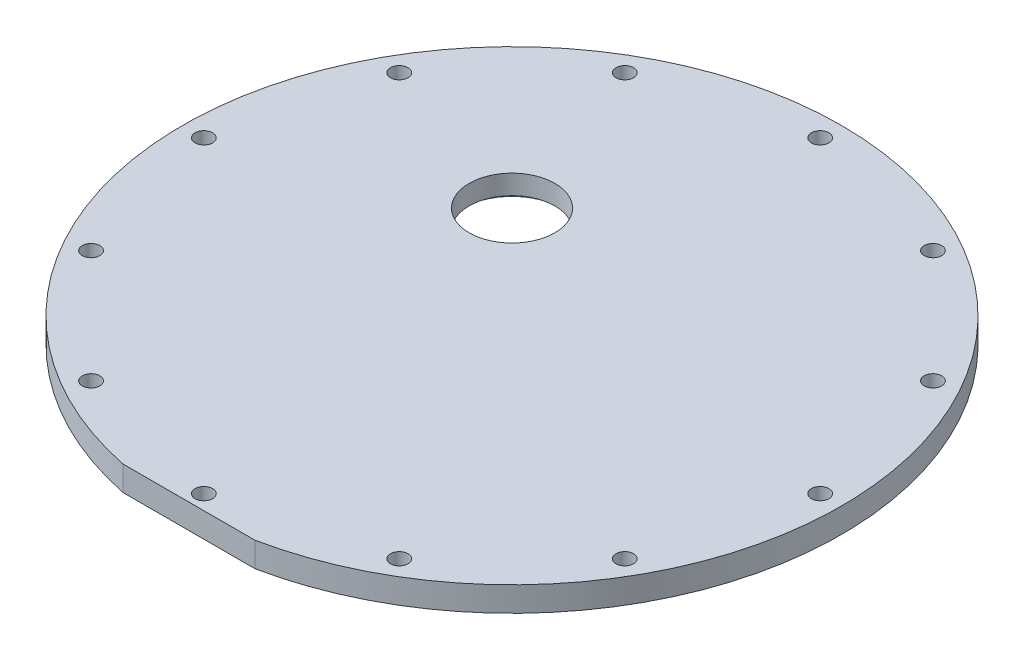
ISO-10303-21;
HEADER;
FILE_DESCRIPTION(('STEP AP214'),'2;1');
FILE_NAME('part.step','',(''),(''),'','','');
FILE_SCHEMA(('AUTOMOTIVE_DESIGN { 1 0 10303 214 1 1 1 1 }'));
ENDSEC;
DATA;
#1=APPLICATION_CONTEXT('core data for automotive mechanical design processes');
#2=APPLICATION_PROTOCOL_DEFINITION('international standard','automotive_design',2000,#1);
#3=PRODUCT_CONTEXT('',#1,'mechanical');
#4=PRODUCT('Part','Part','',(#3));
#5=PRODUCT_RELATED_PRODUCT_CATEGORY('part','',(#4));
#6=PRODUCT_DEFINITION_FORMATION('','',#4);
#7=PRODUCT_DEFINITION_CONTEXT('part definition',#1,'design');
#8=PRODUCT_DEFINITION('design','',#6,#7);
#9=PRODUCT_DEFINITION_SHAPE('','',#8);
#10=(LENGTH_UNIT() NAMED_UNIT(*) SI_UNIT(.MILLI.,.METRE.));
#11=(NAMED_UNIT(*) PLANE_ANGLE_UNIT() SI_UNIT($,.RADIAN.));
#12=(NAMED_UNIT(*) SI_UNIT($,.STERADIAN.) SOLID_ANGLE_UNIT());
#13=UNCERTAINTY_MEASURE_WITH_UNIT(LENGTH_MEASURE(1.E-05),#10,'distance_accuracy_value','');
#14=(GEOMETRIC_REPRESENTATION_CONTEXT(3) GLOBAL_UNCERTAINTY_ASSIGNED_CONTEXT((#13)) GLOBAL_UNIT_ASSIGNED_CONTEXT((#10,
#11,#12)) REPRESENTATION_CONTEXT('',''));
#15=CARTESIAN_POINT('',(0.,0.,0.));
#16=DIRECTION('',(0.,0.,1.));
#17=DIRECTION('',(1.,0.,0.));
#18=AXIS2_PLACEMENT_3D('',#15,#16,#17);
#19=CARTESIAN_POINT('',(-35.9210244842765,9.526,-35.9210244842767));
#20=DIRECTION('',(0.,-1.,0.));
#21=DIRECTION('',(0.,0.,-1.));
#22=AXIS2_PLACEMENT_3D('',#19,#20,#21);
#23=CYLINDRICAL_SURFACE('',#22,16.51);
#24=CARTESIAN_POINT('',(-35.9210244842765,9.52499999999999,-35.9210244842767));
#25=DIRECTION('',(0.,1.,0.));
#26=DIRECTION('',(0.,0.,1.));
#27=AXIS2_PLACEMENT_3D('',#24,#25,#26);
#28=CIRCLE('',#27,16.51);
#29=CARTESIAN_POINT('',(-35.9210244842765,9.52499999999999,-19.4110244842767));
#30=VERTEX_POINT('',#29);
#31=EDGE_CURVE('E188',#30,#30,#28,.F.);
#32=ORIENTED_EDGE('',*,*,#31,.F.);
#33=EDGE_LOOP('',(#32));
#34=FACE_BOUND('',#33,.T.);
#35=CARTESIAN_POINT('',(-35.9210244842765,2.,-35.9210244842767));
#36=DIRECTION('',(0.,-1.,0.));
#37=DIRECTION('',(0.,0.,-1.));
#38=AXIS2_PLACEMENT_3D('',#35,#36,#37);
#39=CIRCLE('',#38,16.51);
#40=CARTESIAN_POINT('',(-35.9210244842765,2.,-52.4310244842767));
#41=VERTEX_POINT('',#40);
#42=EDGE_CURVE('E47',#41,#41,#39,.F.);
#43=ORIENTED_EDGE('',*,*,#42,.F.);
#44=EDGE_LOOP('',(#43));
#45=FACE_BOUND('',#44,.T.);
#46=ADVANCED_FACE('F43',(#34,#45),#23,.F.);
#47=CARTESIAN_POINT('',(0.,0.,0.));
#48=DIRECTION('',(0.,-1.,0.));
#49=DIRECTION('',(0.,0.,-1.));
#50=AXIS2_PLACEMENT_3D('',#47,#48,#49);
#51=PLANE('',#50);
#52=CARTESIAN_POINT('',(-35.9210244842765,0.,-35.9210244842767));
#53=DIRECTION('',(0.,-1.,0.));
#54=DIRECTION('',(0.,0.,-1.));
#55=AXIS2_PLACEMENT_3D('',#52,#53,#54);
#56=CIRCLE('',#55,19.);
#57=CARTESIAN_POINT('',(-35.9210244842765,0.,-54.9210244842767));
#58=VERTEX_POINT('',#57);
#59=EDGE_CURVE('E192',#58,#58,#56,.T.);
#60=ORIENTED_EDGE('',*,*,#59,.F.);
#61=EDGE_LOOP('',(#60));
#62=FACE_BOUND('',#61,.T.);
#63=DIRECTION('',(-1.,0.,0.));
#64=VECTOR('',#63,1.);
#65=CARTESIAN_POINT('',(-25.4,0.,124.434078933385));
#66=LINE('',#65,#64);
#67=CARTESIAN_POINT('',(25.4,0.,124.434078933385));
#68=VERTEX_POINT('',#67);
#69=CARTESIAN_POINT('',(-25.4,0.,124.434078933385));
#70=VERTEX_POINT('',#69);
#71=EDGE_CURVE('E77',#68,#70,#66,.T.);
#72=ORIENTED_EDGE('',*,*,#71,.T.);
#73=CARTESIAN_POINT('',(0.,0.,0.));
#74=DIRECTION('',(0.,-1.,0.));
#75=DIRECTION('',(0.,0.,-1.));
#76=AXIS2_PLACEMENT_3D('',#73,#74,#75);
#77=CIRCLE('',#76,127.);
#78=EDGE_CURVE('E11',#70,#68,#77,.T.);
#79=ORIENTED_EDGE('',*,*,#78,.T.);
#80=EDGE_LOOP('',(#72,#79));
#81=FACE_BOUND('',#80,.T.);
#82=CARTESIAN_POINT('',(0.,0.,-118.745));
#83=DIRECTION('',(0.,-1.,0.));
#84=DIRECTION('',(0.,0.,-1.));
#85=AXIS2_PLACEMENT_3D('',#82,#83,#84);
#86=CIRCLE('',#85,3.3782);
#87=CARTESIAN_POINT('',(0.,0.,-122.1232));
#88=VERTEX_POINT('',#87);
#89=EDGE_CURVE('E177',#88,#88,#86,.T.);
#90=ORIENTED_EDGE('',*,*,#89,.F.);
#91=EDGE_LOOP('',(#90));
#92=FACE_BOUND('',#91,.T.);
#93=CARTESIAN_POINT('',(59.3725,0.,-102.836186572383));
#94=DIRECTION('',(0.,-1.,0.));
#95=DIRECTION('',(0.,0.,-1.));
#96=AXIS2_PLACEMENT_3D('',#93,#94,#95);
#97=CIRCLE('',#96,3.3782);
#98=CARTESIAN_POINT('',(59.3725,0.,-106.214386572383));
#99=VERTEX_POINT('',#98);
#100=EDGE_CURVE('E169',#99,#99,#97,.T.);
#101=ORIENTED_EDGE('',*,*,#100,.F.);
#102=EDGE_LOOP('',(#101));
#103=FACE_BOUND('',#102,.T.);
#104=CARTESIAN_POINT('',(102.836186572383,0.,-59.3725));
#105=DIRECTION('',(0.,-1.,0.));
#106=DIRECTION('',(0.,0.,-1.));
#107=AXIS2_PLACEMENT_3D('',#104,#105,#106);
#108=CIRCLE('',#107,3.3782);
#109=CARTESIAN_POINT('',(102.836186572383,0.,-62.7507));
#110=VERTEX_POINT('',#109);
#111=EDGE_CURVE('E161',#110,#110,#108,.T.);
#112=ORIENTED_EDGE('',*,*,#111,.F.);
#113=EDGE_LOOP('',(#112));
#114=FACE_BOUND('',#113,.T.);
#115=CARTESIAN_POINT('',(118.745,0.,0.));
#116=DIRECTION('',(0.,-1.,0.));
#117=DIRECTION('',(0.,0.,-1.));
#118=AXIS2_PLACEMENT_3D('',#115,#116,#117);
#119=CIRCLE('',#118,3.3782);
#120=CARTESIAN_POINT('',(118.745,0.,-3.37820000000001));
#121=VERTEX_POINT('',#120);
#122=EDGE_CURVE('E153',#121,#121,#119,.T.);
#123=ORIENTED_EDGE('',*,*,#122,.F.);
#124=EDGE_LOOP('',(#123));
#125=FACE_BOUND('',#124,.T.);
#126=CARTESIAN_POINT('',(102.836186572383,0.,59.3725));
#127=DIRECTION('',(0.,-1.,0.));
#128=DIRECTION('',(0.,0.,-1.));
#129=AXIS2_PLACEMENT_3D('',#126,#127,#128);
#130=CIRCLE('',#129,3.3782);
#131=CARTESIAN_POINT('',(102.836186572383,0.,55.9943));
#132=VERTEX_POINT('',#131);
#133=EDGE_CURVE('E145',#132,#132,#130,.T.);
#134=ORIENTED_EDGE('',*,*,#133,.F.);
#135=EDGE_LOOP('',(#134));
#136=FACE_BOUND('',#135,.T.);
#137=CARTESIAN_POINT('',(59.3725,0.,102.836186572383));
#138=DIRECTION('',(0.,-1.,0.));
#139=DIRECTION('',(0.,0.,-1.));
#140=AXIS2_PLACEMENT_3D('',#137,#138,#139);
#141=CIRCLE('',#140,3.3782);
#142=CARTESIAN_POINT('',(59.3725,0.,99.4579865723831));
#143=VERTEX_POINT('',#142);
#144=EDGE_CURVE('E137',#143,#143,#141,.T.);
#145=ORIENTED_EDGE('',*,*,#144,.F.);
#146=EDGE_LOOP('',(#145));
#147=FACE_BOUND('',#146,.T.);
#148=CARTESIAN_POINT('',(0.,0.,118.745));
#149=DIRECTION('',(0.,-1.,0.));
#150=DIRECTION('',(0.,0.,-1.));
#151=AXIS2_PLACEMENT_3D('',#148,#149,#150);
#152=CIRCLE('',#151,3.3782);
#153=CARTESIAN_POINT('',(0.,0.,115.3668));
#154=VERTEX_POINT('',#153);
#155=EDGE_CURVE('E129',#154,#154,#152,.T.);
#156=ORIENTED_EDGE('',*,*,#155,.F.);
#157=EDGE_LOOP('',(#156));
#158=FACE_BOUND('',#157,.T.);
#159=CARTESIAN_POINT('',(-59.3725,0.,102.836186572383));
#160=DIRECTION('',(0.,-1.,0.));
#161=DIRECTION('',(0.,0.,-1.));
#162=AXIS2_PLACEMENT_3D('',#159,#160,#161);
#163=CIRCLE('',#162,3.3782);
#164=CARTESIAN_POINT('',(-59.3725,0.,99.4579865723832));
#165=VERTEX_POINT('',#164);
#166=EDGE_CURVE('E121',#165,#165,#163,.T.);
#167=ORIENTED_EDGE('',*,*,#166,.F.);
#168=EDGE_LOOP('',(#167));
#169=FACE_BOUND('',#168,.T.);
#170=CARTESIAN_POINT('',(-102.836186572383,0.,59.3725000000001));
#171=DIRECTION('',(0.,-1.,0.));
#172=DIRECTION('',(0.,0.,-1.));
#173=AXIS2_PLACEMENT_3D('',#170,#171,#172);
#174=CIRCLE('',#173,3.3782);
#175=CARTESIAN_POINT('',(-102.836186572383,0.,55.9943000000001));
#176=VERTEX_POINT('',#175);
#177=EDGE_CURVE('E113',#176,#176,#174,.T.);
#178=ORIENTED_EDGE('',*,*,#177,.F.);
#179=EDGE_LOOP('',(#178));
#180=FACE_BOUND('',#179,.T.);
#181=CARTESIAN_POINT('',(-118.745,0.,0.));
#182=DIRECTION('',(0.,-1.,0.));
#183=DIRECTION('',(0.,0.,-1.));
#184=AXIS2_PLACEMENT_3D('',#181,#182,#183);
#185=CIRCLE('',#184,3.3782);
#186=CARTESIAN_POINT('',(-118.745,0.,-3.37819999999998));
#187=VERTEX_POINT('',#186);
#188=EDGE_CURVE('E105',#187,#187,#185,.T.);
#189=ORIENTED_EDGE('',*,*,#188,.F.);
#190=EDGE_LOOP('',(#189));
#191=FACE_BOUND('',#190,.T.);
#192=CARTESIAN_POINT('',(-102.836186572383,0.,-59.3724999999999));
#193=DIRECTION('',(0.,-1.,0.));
#194=DIRECTION('',(0.,0.,-1.));
#195=AXIS2_PLACEMENT_3D('',#192,#193,#194);
#196=CIRCLE('',#195,3.3782);
#197=CARTESIAN_POINT('',(-102.836186572383,0.,-62.7506999999999));
#198=VERTEX_POINT('',#197);
#199=EDGE_CURVE('E97',#198,#198,#196,.T.);
#200=ORIENTED_EDGE('',*,*,#199,.F.);
#201=EDGE_LOOP('',(#200));
#202=FACE_BOUND('',#201,.T.);
#203=CARTESIAN_POINT('',(-59.3725,0.,-102.836186572383));
#204=DIRECTION('',(0.,-1.,0.));
#205=DIRECTION('',(0.,0.,-1.));
#206=AXIS2_PLACEMENT_3D('',#203,#204,#205);
#207=CIRCLE('',#206,3.3782);
#208=CARTESIAN_POINT('',(-59.3725,0.,-106.214386572383));
#209=VERTEX_POINT('',#208);
#210=EDGE_CURVE('E87',#209,#209,#207,.T.);
#211=ORIENTED_EDGE('',*,*,#210,.F.);
#212=EDGE_LOOP('',(#211));
#213=FACE_BOUND('',#212,.T.);
#214=ADVANCED_FACE('F45',(#62,#81,#92,#103,#114,#125,#136,#147,#158,#169,#180,#191,#202,#213),
#51,.T.);
#215=CARTESIAN_POINT('',(0.,0.,0.));
#216=DIRECTION('',(0.,-1.,0.));
#217=DIRECTION('',(0.,0.,-1.));
#218=AXIS2_PLACEMENT_3D('',#215,#216,#217);
#219=CYLINDRICAL_SURFACE('',#218,127.);
#220=DIRECTION('',(0.,-1.,0.));
#221=VECTOR('',#220,1.);
#222=CARTESIAN_POINT('',(25.4,0.,124.434078933385));
#223=LINE('',#222,#221);
#224=CARTESIAN_POINT('',(25.4,9.525,124.434078933385));
#225=VERTEX_POINT('',#224);
#226=EDGE_CURVE('E60',#225,#68,#223,.T.);
#227=ORIENTED_EDGE('',*,*,#226,.T.);
#228=ORIENTED_EDGE('',*,*,#78,.F.);
#229=DIRECTION('',(0.,-1.,0.));
#230=VECTOR('',#229,1.);
#231=CARTESIAN_POINT('',(-25.4,0.,124.434078933385));
#232=LINE('',#231,#230);
#233=CARTESIAN_POINT('',(-25.4,9.525,124.434078933385));
#234=VERTEX_POINT('',#233);
#235=EDGE_CURVE('E65',#70,#234,#232,.F.);
#236=ORIENTED_EDGE('',*,*,#235,.T.);
#237=CARTESIAN_POINT('',(0.,9.525,0.));
#238=DIRECTION('',(0.,-1.,0.));
#239=DIRECTION('',(0.,0.,-1.));
#240=AXIS2_PLACEMENT_3D('',#237,#238,#239);
#241=CIRCLE('',#240,127.);
#242=EDGE_CURVE('E53',#234,#225,#241,.T.);
#243=ORIENTED_EDGE('',*,*,#242,.T.);
#244=EDGE_LOOP('',(#227,#228,#236,#243));
#245=FACE_BOUND('',#244,.T.);
#246=ADVANCED_FACE('F81',(#245),#219,.T.);
#247=CARTESIAN_POINT('',(127.,9.52499999999999,0.));
#248=DIRECTION('',(0.,1.,0.));
#249=DIRECTION('',(0.,0.,1.));
#250=AXIS2_PLACEMENT_3D('',#247,#248,#249);
#251=PLANE('',#250);
#252=ORIENTED_EDGE('',*,*,#31,.T.);
#253=EDGE_LOOP('',(#252));
#254=FACE_BOUND('',#253,.T.);
#255=DIRECTION('',(-1.,0.,0.));
#256=VECTOR('',#255,1.);
#257=CARTESIAN_POINT('',(-25.4,9.52499999999999,124.434078933385));
#258=LINE('',#257,#256);
#259=EDGE_CURVE('E70',#225,#234,#258,.T.);
#260=ORIENTED_EDGE('',*,*,#259,.F.);
#261=ORIENTED_EDGE('',*,*,#242,.F.);
#262=EDGE_LOOP('',(#260,#261));
#263=FACE_BOUND('',#262,.T.);
#264=CARTESIAN_POINT('',(0.,9.52499999999999,-118.745));
#265=DIRECTION('',(0.,1.,0.));
#266=DIRECTION('',(0.,0.,1.));
#267=AXIS2_PLACEMENT_3D('',#264,#265,#266);
#268=CIRCLE('',#267,3.3782);
#269=CARTESIAN_POINT('',(0.,9.52499999999999,-115.3668));
#270=VERTEX_POINT('',#269);
#271=EDGE_CURVE('E76',#270,#270,#268,.T.);
#272=ORIENTED_EDGE('',*,*,#271,.F.);
#273=EDGE_LOOP('',(#272));
#274=FACE_BOUND('',#273,.T.);
#275=CARTESIAN_POINT('',(59.3725,9.52499999999999,-102.836186572383));
#276=DIRECTION('',(0.,1.,0.));
#277=DIRECTION('',(0.,0.,1.));
#278=AXIS2_PLACEMENT_3D('',#275,#276,#277);
#279=CIRCLE('',#278,3.3782);
#280=CARTESIAN_POINT('',(59.3725,9.52499999999999,-99.4579865723832));
#281=VERTEX_POINT('',#280);
#282=EDGE_CURVE('E173',#281,#281,#279,.T.);
#283=ORIENTED_EDGE('',*,*,#282,.F.);
#284=EDGE_LOOP('',(#283));
#285=FACE_BOUND('',#284,.T.);
#286=CARTESIAN_POINT('',(102.836186572383,9.52499999999999,-59.3725));
#287=DIRECTION('',(0.,1.,0.));
#288=DIRECTION('',(0.,0.,1.));
#289=AXIS2_PLACEMENT_3D('',#286,#287,#288);
#290=CIRCLE('',#289,3.3782);
#291=CARTESIAN_POINT('',(102.836186572383,9.52499999999999,-55.9943));
#292=VERTEX_POINT('',#291);
#293=EDGE_CURVE('E165',#292,#292,#290,.T.);
#294=ORIENTED_EDGE('',*,*,#293,.F.);
#295=EDGE_LOOP('',(#294));
#296=FACE_BOUND('',#295,.T.);
#297=CARTESIAN_POINT('',(118.745,9.52499999999999,0.));
#298=DIRECTION('',(0.,1.,0.));
#299=DIRECTION('',(0.,0.,1.));
#300=AXIS2_PLACEMENT_3D('',#297,#298,#299);
#301=CIRCLE('',#300,3.3782);
#302=CARTESIAN_POINT('',(118.745,9.52499999999999,3.37819999999999));
#303=VERTEX_POINT('',#302);
#304=EDGE_CURVE('E157',#303,#303,#301,.T.);
#305=ORIENTED_EDGE('',*,*,#304,.F.);
#306=EDGE_LOOP('',(#305));
#307=FACE_BOUND('',#306,.T.);
#308=CARTESIAN_POINT('',(102.836186572383,9.52499999999999,59.3725));
#309=DIRECTION('',(0.,1.,0.));
#310=DIRECTION('',(0.,0.,1.));
#311=AXIS2_PLACEMENT_3D('',#308,#309,#310);
#312=CIRCLE('',#311,3.3782);
#313=CARTESIAN_POINT('',(102.836186572383,9.52499999999999,62.7507));
#314=VERTEX_POINT('',#313);
#315=EDGE_CURVE('E149',#314,#314,#312,.T.);
#316=ORIENTED_EDGE('',*,*,#315,.F.);
#317=EDGE_LOOP('',(#316));
#318=FACE_BOUND('',#317,.T.);
#319=CARTESIAN_POINT('',(59.3725,9.52499999999999,102.836186572383));
#320=DIRECTION('',(0.,1.,0.));
#321=DIRECTION('',(0.,0.,1.));
#322=AXIS2_PLACEMENT_3D('',#319,#320,#321);
#323=CIRCLE('',#322,3.3782);
#324=CARTESIAN_POINT('',(59.3725,9.52499999999999,106.214386572383));
#325=VERTEX_POINT('',#324);
#326=EDGE_CURVE('E141',#325,#325,#323,.T.);
#327=ORIENTED_EDGE('',*,*,#326,.F.);
#328=EDGE_LOOP('',(#327));
#329=FACE_BOUND('',#328,.T.);
#330=CARTESIAN_POINT('',(0.,9.52499999999999,118.745));
#331=DIRECTION('',(0.,1.,0.));
#332=DIRECTION('',(0.,0.,1.));
#333=AXIS2_PLACEMENT_3D('',#330,#331,#332);
#334=CIRCLE('',#333,3.3782);
#335=CARTESIAN_POINT('',(0.,9.52499999999999,122.1232));
#336=VERTEX_POINT('',#335);
#337=EDGE_CURVE('E133',#336,#336,#334,.T.);
#338=ORIENTED_EDGE('',*,*,#337,.F.);
#339=EDGE_LOOP('',(#338));
#340=FACE_BOUND('',#339,.T.);
#341=CARTESIAN_POINT('',(-59.3725,9.52499999999999,102.836186572383));
#342=DIRECTION('',(0.,1.,0.));
#343=DIRECTION('',(0.,0.,1.));
#344=AXIS2_PLACEMENT_3D('',#341,#342,#343);
#345=CIRCLE('',#344,3.3782);
#346=CARTESIAN_POINT('',(-59.3725,9.52499999999999,106.214386572383));
#347=VERTEX_POINT('',#346);
#348=EDGE_CURVE('E125',#347,#347,#345,.T.);
#349=ORIENTED_EDGE('',*,*,#348,.F.);
#350=EDGE_LOOP('',(#349));
#351=FACE_BOUND('',#350,.T.);
#352=CARTESIAN_POINT('',(-102.836186572383,9.52499999999999,59.3725000000001));
#353=DIRECTION('',(0.,1.,0.));
#354=DIRECTION('',(0.,0.,1.));
#355=AXIS2_PLACEMENT_3D('',#352,#353,#354);
#356=CIRCLE('',#355,3.3782);
#357=CARTESIAN_POINT('',(-102.836186572383,9.52499999999999,62.7507000000001));
#358=VERTEX_POINT('',#357);
#359=EDGE_CURVE('E117',#358,#358,#356,.T.);
#360=ORIENTED_EDGE('',*,*,#359,.F.);
#361=EDGE_LOOP('',(#360));
#362=FACE_BOUND('',#361,.T.);
#363=CARTESIAN_POINT('',(-118.745,9.52499999999999,0.));
#364=DIRECTION('',(0.,1.,0.));
#365=DIRECTION('',(0.,0.,1.));
#366=AXIS2_PLACEMENT_3D('',#363,#364,#365);
#367=CIRCLE('',#366,3.3782);
#368=CARTESIAN_POINT('',(-118.745,9.52499999999999,3.37820000000002));
#369=VERTEX_POINT('',#368);
#370=EDGE_CURVE('E109',#369,#369,#367,.T.);
#371=ORIENTED_EDGE('',*,*,#370,.F.);
#372=EDGE_LOOP('',(#371));
#373=FACE_BOUND('',#372,.T.);
#374=CARTESIAN_POINT('',(-102.836186572383,9.52499999999999,-59.3724999999999));
#375=DIRECTION('',(0.,1.,0.));
#376=DIRECTION('',(0.,0.,1.));
#377=AXIS2_PLACEMENT_3D('',#374,#375,#376);
#378=CIRCLE('',#377,3.3782);
#379=CARTESIAN_POINT('',(-102.836186572383,9.52499999999999,-55.9942999999999));
#380=VERTEX_POINT('',#379);
#381=EDGE_CURVE('E101',#380,#380,#378,.T.);
#382=ORIENTED_EDGE('',*,*,#381,.F.);
#383=EDGE_LOOP('',(#382));
#384=FACE_BOUND('',#383,.T.);
#385=CARTESIAN_POINT('',(-59.3725,9.52499999999999,-102.836186572383));
#386=DIRECTION('',(0.,1.,0.));
#387=DIRECTION('',(0.,0.,1.));
#388=AXIS2_PLACEMENT_3D('',#385,#386,#387);
#389=CIRCLE('',#388,3.3782);
#390=CARTESIAN_POINT('',(-59.3725,9.52499999999999,-99.4579865723831));
#391=VERTEX_POINT('',#390);
#392=EDGE_CURVE('E91',#391,#391,#389,.T.);
#393=ORIENTED_EDGE('',*,*,#392,.F.);
#394=EDGE_LOOP('',(#393));
#395=FACE_BOUND('',#394,.T.);
#396=ADVANCED_FACE('F84',(#254,#263,#274,#285,#296,#307,#318,#329,#340,#351,#362,#373,#384,
#395),#251,.T.);
#397=CARTESIAN_POINT('',(-59.3725,9.52499999999999,-102.836186572383));
#398=DIRECTION('',(0.,1.,0.));
#399=DIRECTION('',(0.,0.,1.));
#400=AXIS2_PLACEMENT_3D('',#397,#398,#399);
#401=CYLINDRICAL_SURFACE('',#400,3.3782);
#402=ORIENTED_EDGE('',*,*,#392,.T.);
#403=EDGE_LOOP('',(#402));
#404=FACE_BOUND('',#403,.T.);
#405=ORIENTED_EDGE('',*,*,#210,.T.);
#406=EDGE_LOOP('',(#405));
#407=FACE_BOUND('',#406,.T.);
#408=ADVANCED_FACE('F264',(#404,#407),#401,.F.);
#409=CARTESIAN_POINT('',(-102.836186572383,9.52499999999999,-59.3724999999999));
#410=DIRECTION('',(0.,1.,0.));
#411=DIRECTION('',(0.,0.,1.));
#412=AXIS2_PLACEMENT_3D('',#409,#410,#411);
#413=CYLINDRICAL_SURFACE('',#412,3.3782);
#414=ORIENTED_EDGE('',*,*,#381,.T.);
#415=EDGE_LOOP('',(#414));
#416=FACE_BOUND('',#415,.T.);
#417=ORIENTED_EDGE('',*,*,#199,.T.);
#418=EDGE_LOOP('',(#417));
#419=FACE_BOUND('',#418,.T.);
#420=ADVANCED_FACE('F260',(#416,#419),#413,.F.);
#421=CARTESIAN_POINT('',(-118.745,9.52499999999999,0.));
#422=DIRECTION('',(0.,1.,0.));
#423=DIRECTION('',(0.,0.,1.));
#424=AXIS2_PLACEMENT_3D('',#421,#422,#423);
#425=CYLINDRICAL_SURFACE('',#424,3.3782);
#426=ORIENTED_EDGE('',*,*,#370,.T.);
#427=EDGE_LOOP('',(#426));
#428=FACE_BOUND('',#427,.T.);
#429=ORIENTED_EDGE('',*,*,#188,.T.);
#430=EDGE_LOOP('',(#429));
#431=FACE_BOUND('',#430,.T.);
#432=ADVANCED_FACE('F256',(#428,#431),#425,.F.);
#433=CARTESIAN_POINT('',(-102.836186572383,9.52499999999999,59.3725000000001));
#434=DIRECTION('',(0.,1.,0.));
#435=DIRECTION('',(0.,0.,1.));
#436=AXIS2_PLACEMENT_3D('',#433,#434,#435);
#437=CYLINDRICAL_SURFACE('',#436,3.3782);
#438=ORIENTED_EDGE('',*,*,#359,.T.);
#439=EDGE_LOOP('',(#438));
#440=FACE_BOUND('',#439,.T.);
#441=ORIENTED_EDGE('',*,*,#177,.T.);
#442=EDGE_LOOP('',(#441));
#443=FACE_BOUND('',#442,.T.);
#444=ADVANCED_FACE('F252',(#440,#443),#437,.F.);
#445=CARTESIAN_POINT('',(-59.3725,9.52499999999999,102.836186572383));
#446=DIRECTION('',(0.,1.,0.));
#447=DIRECTION('',(0.,0.,1.));
#448=AXIS2_PLACEMENT_3D('',#445,#446,#447);
#449=CYLINDRICAL_SURFACE('',#448,3.3782);
#450=ORIENTED_EDGE('',*,*,#348,.T.);
#451=EDGE_LOOP('',(#450));
#452=FACE_BOUND('',#451,.T.);
#453=ORIENTED_EDGE('',*,*,#166,.T.);
#454=EDGE_LOOP('',(#453));
#455=FACE_BOUND('',#454,.T.);
#456=ADVANCED_FACE('F248',(#452,#455),#449,.F.);
#457=CARTESIAN_POINT('',(0.,9.52499999999999,118.745));
#458=DIRECTION('',(0.,1.,0.));
#459=DIRECTION('',(0.,0.,1.));
#460=AXIS2_PLACEMENT_3D('',#457,#458,#459);
#461=CYLINDRICAL_SURFACE('',#460,3.3782);
#462=ORIENTED_EDGE('',*,*,#337,.T.);
#463=EDGE_LOOP('',(#462));
#464=FACE_BOUND('',#463,.T.);
#465=ORIENTED_EDGE('',*,*,#155,.T.);
#466=EDGE_LOOP('',(#465));
#467=FACE_BOUND('',#466,.T.);
#468=ADVANCED_FACE('F244',(#464,#467),#461,.F.);
#469=CARTESIAN_POINT('',(59.3725,9.52499999999999,102.836186572383));
#470=DIRECTION('',(0.,1.,0.));
#471=DIRECTION('',(0.,0.,1.));
#472=AXIS2_PLACEMENT_3D('',#469,#470,#471);
#473=CYLINDRICAL_SURFACE('',#472,3.3782);
#474=ORIENTED_EDGE('',*,*,#326,.T.);
#475=EDGE_LOOP('',(#474));
#476=FACE_BOUND('',#475,.T.);
#477=ORIENTED_EDGE('',*,*,#144,.T.);
#478=EDGE_LOOP('',(#477));
#479=FACE_BOUND('',#478,.T.);
#480=ADVANCED_FACE('F240',(#476,#479),#473,.F.);
#481=CARTESIAN_POINT('',(102.836186572383,9.52499999999999,59.3725));
#482=DIRECTION('',(0.,1.,0.));
#483=DIRECTION('',(0.,0.,1.));
#484=AXIS2_PLACEMENT_3D('',#481,#482,#483);
#485=CYLINDRICAL_SURFACE('',#484,3.3782);
#486=ORIENTED_EDGE('',*,*,#315,.T.);
#487=EDGE_LOOP('',(#486));
#488=FACE_BOUND('',#487,.T.);
#489=ORIENTED_EDGE('',*,*,#133,.T.);
#490=EDGE_LOOP('',(#489));
#491=FACE_BOUND('',#490,.T.);
#492=ADVANCED_FACE('F236',(#488,#491),#485,.F.);
#493=CARTESIAN_POINT('',(118.745,9.52499999999999,0.));
#494=DIRECTION('',(0.,1.,0.));
#495=DIRECTION('',(0.,0.,1.));
#496=AXIS2_PLACEMENT_3D('',#493,#494,#495);
#497=CYLINDRICAL_SURFACE('',#496,3.3782);
#498=ORIENTED_EDGE('',*,*,#304,.T.);
#499=EDGE_LOOP('',(#498));
#500=FACE_BOUND('',#499,.T.);
#501=ORIENTED_EDGE('',*,*,#122,.T.);
#502=EDGE_LOOP('',(#501));
#503=FACE_BOUND('',#502,.T.);
#504=ADVANCED_FACE('F232',(#500,#503),#497,.F.);
#505=CARTESIAN_POINT('',(102.836186572383,9.52499999999999,-59.3725));
#506=DIRECTION('',(0.,1.,0.));
#507=DIRECTION('',(0.,0.,1.));
#508=AXIS2_PLACEMENT_3D('',#505,#506,#507);
#509=CYLINDRICAL_SURFACE('',#508,3.3782);
#510=ORIENTED_EDGE('',*,*,#293,.T.);
#511=EDGE_LOOP('',(#510));
#512=FACE_BOUND('',#511,.T.);
#513=ORIENTED_EDGE('',*,*,#111,.T.);
#514=EDGE_LOOP('',(#513));
#515=FACE_BOUND('',#514,.T.);
#516=ADVANCED_FACE('F228',(#512,#515),#509,.F.);
#517=CARTESIAN_POINT('',(59.3725,9.52499999999999,-102.836186572383));
#518=DIRECTION('',(0.,1.,0.));
#519=DIRECTION('',(0.,0.,1.));
#520=AXIS2_PLACEMENT_3D('',#517,#518,#519);
#521=CYLINDRICAL_SURFACE('',#520,3.3782);
#522=ORIENTED_EDGE('',*,*,#282,.T.);
#523=EDGE_LOOP('',(#522));
#524=FACE_BOUND('',#523,.T.);
#525=ORIENTED_EDGE('',*,*,#100,.T.);
#526=EDGE_LOOP('',(#525));
#527=FACE_BOUND('',#526,.T.);
#528=ADVANCED_FACE('F224',(#524,#527),#521,.F.);
#529=CARTESIAN_POINT('',(0.,9.52499999999999,-118.745));
#530=DIRECTION('',(0.,1.,0.));
#531=DIRECTION('',(0.,0.,1.));
#532=AXIS2_PLACEMENT_3D('',#529,#530,#531);
#533=CYLINDRICAL_SURFACE('',#532,3.3782);
#534=ORIENTED_EDGE('',*,*,#271,.T.);
#535=EDGE_LOOP('',(#534));
#536=FACE_BOUND('',#535,.T.);
#537=ORIENTED_EDGE('',*,*,#89,.T.);
#538=EDGE_LOOP('',(#537));
#539=FACE_BOUND('',#538,.T.);
#540=ADVANCED_FACE('F221',(#536,#539),#533,.F.);
#541=CARTESIAN_POINT('',(-25.4,-0.000999999999999265,124.434078933385));
#542=DIRECTION('',(0.,0.,-1.));
#543=DIRECTION('',(-1.,0.,0.));
#544=AXIS2_PLACEMENT_3D('',#541,#542,#543);
#545=PLANE('',#544);
#546=ORIENTED_EDGE('',*,*,#226,.F.);
#547=ORIENTED_EDGE('',*,*,#259,.T.);
#548=ORIENTED_EDGE('',*,*,#235,.F.);
#549=ORIENTED_EDGE('',*,*,#71,.F.);
#550=EDGE_LOOP('',(#546,#547,#548,#549));
#551=FACE_BOUND('',#550,.T.);
#552=ADVANCED_FACE('F71',(#551),#545,.F.);
#553=CARTESIAN_POINT('',(-35.9210244842765,2.,-35.9210244842767));
#554=DIRECTION('',(0.,-1.,0.));
#555=DIRECTION('',(0.,0.,-1.));
#556=AXIS2_PLACEMENT_3D('',#553,#554,#555);
#557=PLANE('',#556);
#558=CARTESIAN_POINT('',(-35.9210244842765,2.,-35.9210244842767));
#559=DIRECTION('',(0.,-1.,0.));
#560=DIRECTION('',(0.,0.,-1.));
#561=AXIS2_PLACEMENT_3D('',#558,#559,#560);
#562=CIRCLE('',#561,19.);
#563=CARTESIAN_POINT('',(-35.9210244842765,2.,-54.9210244842767));
#564=VERTEX_POINT('',#563);
#565=EDGE_CURVE('E196',#564,#564,#562,.T.);
#566=ORIENTED_EDGE('',*,*,#565,.T.);
#567=EDGE_LOOP('',(#566));
#568=FACE_BOUND('',#567,.T.);
#569=ORIENTED_EDGE('',*,*,#42,.T.);
#570=EDGE_LOOP('',(#569));
#571=FACE_BOUND('',#570,.T.);
#572=ADVANCED_FACE('F205',(#568,#571),#557,.T.);
#573=CARTESIAN_POINT('',(-35.9210244842765,2.,-35.9210244842767));
#574=DIRECTION('',(0.,-1.,0.));
#575=DIRECTION('',(0.,0.,-1.));
#576=AXIS2_PLACEMENT_3D('',#573,#574,#575);
#577=CYLINDRICAL_SURFACE('',#576,19.);
#578=ORIENTED_EDGE('',*,*,#565,.F.);
#579=EDGE_LOOP('',(#578));
#580=FACE_BOUND('',#579,.T.);
#581=ORIENTED_EDGE('',*,*,#59,.T.);
#582=EDGE_LOOP('',(#581));
#583=FACE_BOUND('',#582,.T.);
#584=ADVANCED_FACE('F217',(#580,#583),#577,.F.);
#585=CLOSED_SHELL('',(#46,#214,#246,#396,#408,#420,#432,#444,#456,#468,#480,#492,#504,#516,#528,
#540,#552,#572,#584));
#586=MANIFOLD_SOLID_BREP('B2',#585);
#587=ADVANCED_BREP_SHAPE_REPRESENTATION('',(#18,#586),#14);
#588=SHAPE_DEFINITION_REPRESENTATION(#9,#587);
ENDSEC;
END-ISO-10303-21;
